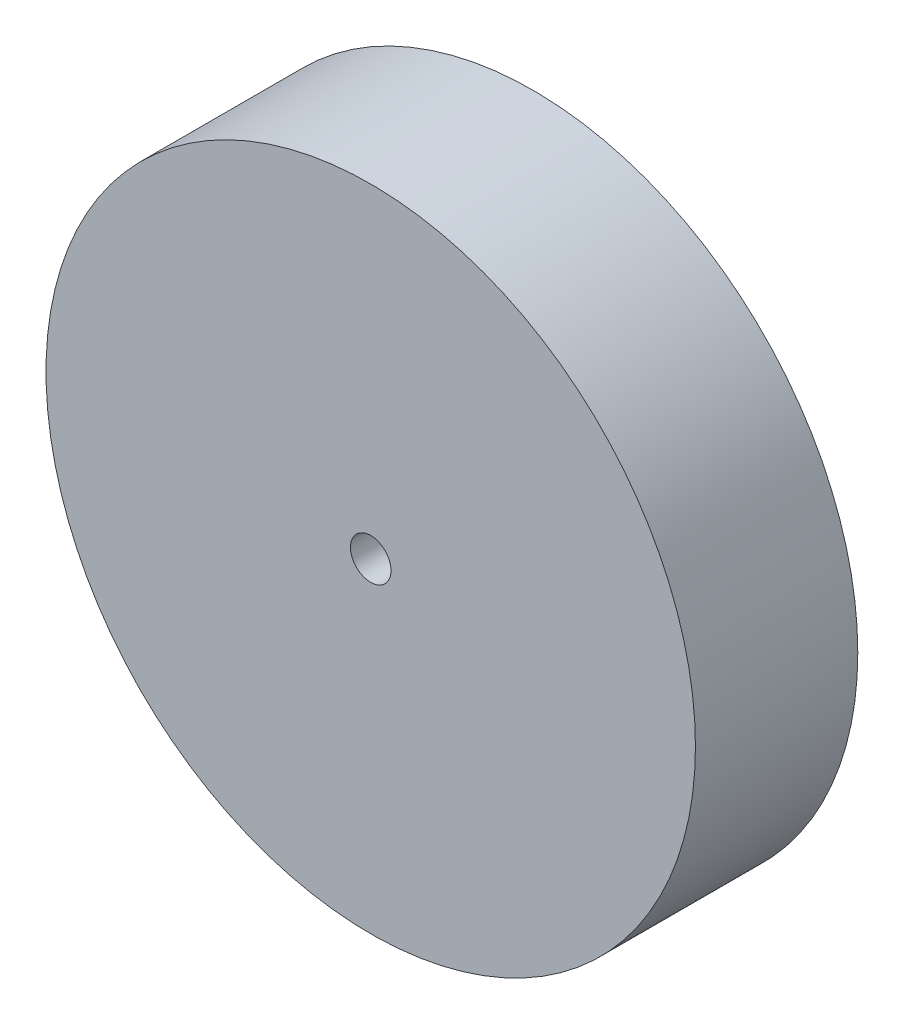
ISO-10303-21;
HEADER;
FILE_DESCRIPTION(('STEP AP214'),'2;1');
FILE_NAME('part.step','',(''),(''),'','','');
FILE_SCHEMA(('AUTOMOTIVE_DESIGN { 1 0 10303 214 1 1 1 1 }'));
ENDSEC;
DATA;
#1=APPLICATION_CONTEXT('core data for automotive mechanical design processes');
#2=APPLICATION_PROTOCOL_DEFINITION('international standard','automotive_design',2000,#1);
#3=PRODUCT_CONTEXT('',#1,'mechanical');
#4=PRODUCT('Part','Part','',(#3));
#5=PRODUCT_RELATED_PRODUCT_CATEGORY('part','',(#4));
#6=PRODUCT_DEFINITION_FORMATION('','',#4);
#7=PRODUCT_DEFINITION_CONTEXT('part definition',#1,'design');
#8=PRODUCT_DEFINITION('design','',#6,#7);
#9=PRODUCT_DEFINITION_SHAPE('','',#8);
#10=(LENGTH_UNIT() NAMED_UNIT(*) SI_UNIT(.MILLI.,.METRE.));
#11=(NAMED_UNIT(*) PLANE_ANGLE_UNIT() SI_UNIT($,.RADIAN.));
#12=(NAMED_UNIT(*) SI_UNIT($,.STERADIAN.) SOLID_ANGLE_UNIT());
#13=UNCERTAINTY_MEASURE_WITH_UNIT(LENGTH_MEASURE(1.E-05),#10,'distance_accuracy_value','');
#14=(GEOMETRIC_REPRESENTATION_CONTEXT(3) GLOBAL_UNCERTAINTY_ASSIGNED_CONTEXT((#13)) GLOBAL_UNIT_ASSIGNED_CONTEXT((#10,
#11,#12)) REPRESENTATION_CONTEXT('',''));
#15=CARTESIAN_POINT('',(0.,0.,0.));
#16=DIRECTION('',(0.,0.,1.));
#17=DIRECTION('',(1.,0.,0.));
#18=AXIS2_PLACEMENT_3D('',#15,#16,#17);
#19=CARTESIAN_POINT('',(0.,0.,31.75));
#20=DIRECTION('',(0.,0.,1.));
#21=DIRECTION('',(1.,0.,0.));
#22=AXIS2_PLACEMENT_3D('',#19,#20,#21);
#23=PLANE('',#22);
#24=CARTESIAN_POINT('',(0.,0.,31.75));
#25=DIRECTION('',(0.,0.,1.));
#26=DIRECTION('',(1.,0.,0.));
#27=AXIS2_PLACEMENT_3D('',#24,#25,#26);
#28=CIRCLE('',#27,63.5);
#29=CARTESIAN_POINT('',(63.5,0.,31.75));
#30=VERTEX_POINT('',#29);
#31=EDGE_CURVE('E10',#30,#30,#28,.T.);
#32=ORIENTED_EDGE('',*,*,#31,.T.);
#33=EDGE_LOOP('',(#32));
#34=FACE_BOUND('',#33,.T.);
#35=CARTESIAN_POINT('',(0.,0.,31.75));
#36=DIRECTION('',(0.,0.,1.));
#37=DIRECTION('',(1.,0.,0.));
#38=AXIS2_PLACEMENT_3D('',#35,#36,#37);
#39=CIRCLE('',#38,3.96875);
#40=CARTESIAN_POINT('',(3.96875,0.,31.75));
#41=VERTEX_POINT('',#40);
#42=EDGE_CURVE('E54',#41,#41,#39,.T.);
#43=ORIENTED_EDGE('',*,*,#42,.F.);
#44=EDGE_LOOP('',(#43));
#45=FACE_BOUND('',#44,.T.);
#46=ADVANCED_FACE('F41',(#34,#45),#23,.T.);
#47=CARTESIAN_POINT('',(0.,0.,0.));
#48=DIRECTION('',(0.,0.,1.));
#49=DIRECTION('',(1.,0.,0.));
#50=AXIS2_PLACEMENT_3D('',#47,#48,#49);
#51=PLANE('',#50);
#52=CARTESIAN_POINT('',(0.,0.,0.));
#53=DIRECTION('',(0.,0.,1.));
#54=DIRECTION('',(1.,0.,0.));
#55=AXIS2_PLACEMENT_3D('',#52,#53,#54);
#56=CIRCLE('',#55,63.5);
#57=CARTESIAN_POINT('',(63.5,0.,0.));
#58=VERTEX_POINT('',#57);
#59=EDGE_CURVE('E45',#58,#58,#56,.T.);
#60=ORIENTED_EDGE('',*,*,#59,.F.);
#61=EDGE_LOOP('',(#60));
#62=FACE_BOUND('',#61,.T.);
#63=CARTESIAN_POINT('',(0.,0.,0.));
#64=DIRECTION('',(0.,0.,1.));
#65=DIRECTION('',(1.,0.,0.));
#66=AXIS2_PLACEMENT_3D('',#63,#64,#65);
#67=CIRCLE('',#66,3.96875);
#68=CARTESIAN_POINT('',(3.96875,0.,0.));
#69=VERTEX_POINT('',#68);
#70=EDGE_CURVE('E56',#69,#69,#67,.T.);
#71=ORIENTED_EDGE('',*,*,#70,.T.);
#72=EDGE_LOOP('',(#71));
#73=FACE_BOUND('',#72,.T.);
#74=ADVANCED_FACE('F68',(#62,#73),#51,.F.);
#75=CARTESIAN_POINT('',(0.,0.,31.75));
#76=DIRECTION('',(0.,0.,-1.));
#77=DIRECTION('',(-1.,0.,0.));
#78=AXIS2_PLACEMENT_3D('',#75,#76,#77);
#79=CYLINDRICAL_SURFACE('',#78,63.5);
#80=ORIENTED_EDGE('',*,*,#31,.F.);
#81=EDGE_LOOP('',(#80));
#82=FACE_BOUND('',#81,.T.);
#83=ORIENTED_EDGE('',*,*,#59,.T.);
#84=EDGE_LOOP('',(#83));
#85=FACE_BOUND('',#84,.T.);
#86=ADVANCED_FACE('F43',(#82,#85),#79,.T.);
#87=CARTESIAN_POINT('',(0.,0.,31.75));
#88=DIRECTION('',(0.,0.,-1.));
#89=DIRECTION('',(-1.,0.,0.));
#90=AXIS2_PLACEMENT_3D('',#87,#88,#89);
#91=CYLINDRICAL_SURFACE('',#90,3.96875);
#92=ORIENTED_EDGE('',*,*,#42,.T.);
#93=EDGE_LOOP('',(#92));
#94=FACE_BOUND('',#93,.T.);
#95=ORIENTED_EDGE('',*,*,#70,.F.);
#96=EDGE_LOOP('',(#95));
#97=FACE_BOUND('',#96,.T.);
#98=ADVANCED_FACE('F64',(#94,#97),#91,.F.);
#99=CLOSED_SHELL('',(#46,#74,#86,#98));
#100=MANIFOLD_SOLID_BREP('B2',#99);
#101=ADVANCED_BREP_SHAPE_REPRESENTATION('',(#18,#100),#14);
#102=SHAPE_DEFINITION_REPRESENTATION(#9,#101);
ENDSEC;
END-ISO-10303-21;
